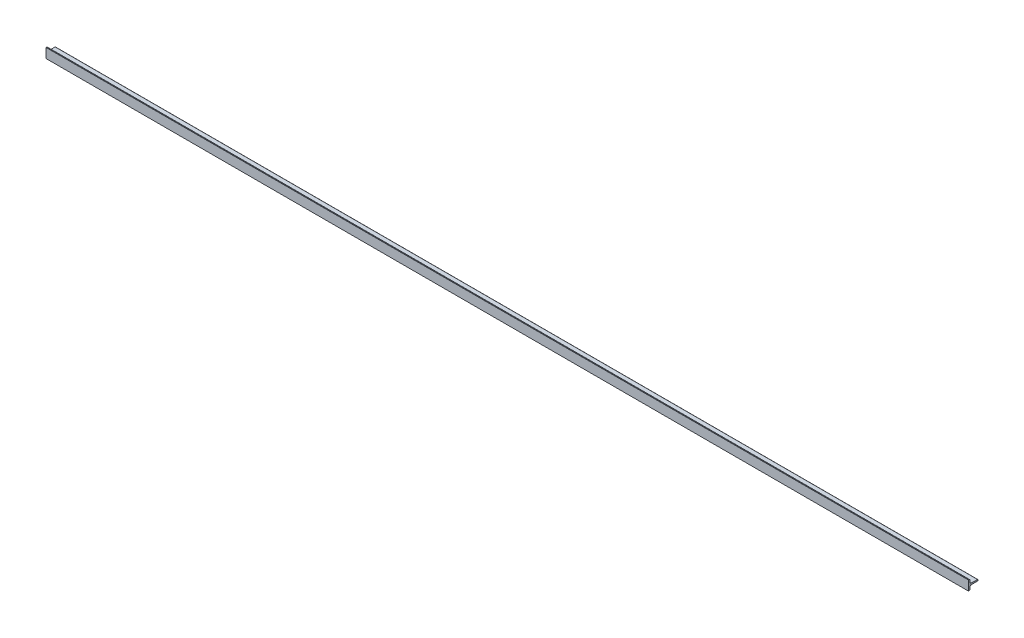
ISO-10303-21;
HEADER;
FILE_DESCRIPTION(('STEP AP214'),'2;1');
FILE_NAME('part.step','',(''),(''),'','','');
FILE_SCHEMA(('AUTOMOTIVE_DESIGN { 1 0 10303 214 1 1 1 1 }'));
ENDSEC;
DATA;
#1=APPLICATION_CONTEXT('core data for automotive mechanical design processes');
#2=APPLICATION_PROTOCOL_DEFINITION('international standard','automotive_design',2000,#1);
#3=PRODUCT_CONTEXT('',#1,'mechanical');
#4=PRODUCT('Part','Part','',(#3));
#5=PRODUCT_RELATED_PRODUCT_CATEGORY('part','',(#4));
#6=PRODUCT_DEFINITION_FORMATION('','',#4);
#7=PRODUCT_DEFINITION_CONTEXT('part definition',#1,'design');
#8=PRODUCT_DEFINITION('design','',#6,#7);
#9=PRODUCT_DEFINITION_SHAPE('','',#8);
#10=(LENGTH_UNIT() NAMED_UNIT(*) SI_UNIT(.MILLI.,.METRE.));
#11=(NAMED_UNIT(*) PLANE_ANGLE_UNIT() SI_UNIT($,.RADIAN.));
#12=(NAMED_UNIT(*) SI_UNIT($,.STERADIAN.) SOLID_ANGLE_UNIT());
#13=UNCERTAINTY_MEASURE_WITH_UNIT(LENGTH_MEASURE(1.E-05),#10,'distance_accuracy_value','');
#14=(GEOMETRIC_REPRESENTATION_CONTEXT(3) GLOBAL_UNCERTAINTY_ASSIGNED_CONTEXT((#13)) GLOBAL_UNIT_ASSIGNED_CONTEXT((#10,
#11,#12)) REPRESENTATION_CONTEXT('',''));
#15=CARTESIAN_POINT('',(0.,0.,0.));
#16=DIRECTION('',(0.,0.,1.));
#17=DIRECTION('',(1.,0.,0.));
#18=AXIS2_PLACEMENT_3D('',#15,#16,#17);
#19=CARTESIAN_POINT('',(1920.,-9.99999999999999,20.));
#20=DIRECTION('',(0.,1.,0.));
#21=DIRECTION('',(0.,0.,1.));
#22=AXIS2_PLACEMENT_3D('',#19,#20,#21);
#23=PLANE('',#22);
#24=DIRECTION('',(0.,0.,-1.));
#25=VECTOR('',#24,1.);
#26=CARTESIAN_POINT('',(0.,-9.99999999999999,20.));
#27=LINE('',#26,#25);
#28=CARTESIAN_POINT('',(0.,-9.99999999999999,20.));
#29=VERTEX_POINT('',#28);
#30=CARTESIAN_POINT('',(0.,-9.99999999999999,18.570314587422));
#31=VERTEX_POINT('',#30);
#32=EDGE_CURVE('E223',#29,#31,#27,.T.);
#33=ORIENTED_EDGE('',*,*,#32,.T.);
#34=DIRECTION('',(-1.,0.,0.));
#35=VECTOR('',#34,1.);
#36=CARTESIAN_POINT('',(1920.,-9.99999999999999,18.570314587422));
#37=LINE('',#36,#35);
#38=CARTESIAN_POINT('',(1920.,-9.99999999999999,18.570314587422));
#39=VERTEX_POINT('',#38);
#40=EDGE_CURVE('E13',#39,#31,#37,.T.);
#41=ORIENTED_EDGE('',*,*,#40,.F.);
#42=DIRECTION('',(0.,0.,-1.));
#43=VECTOR('',#42,1.);
#44=CARTESIAN_POINT('',(1920.,-9.99999999999999,20.));
#45=LINE('',#44,#43);
#46=CARTESIAN_POINT('',(1920.,-9.99999999999999,20.));
#47=VERTEX_POINT('',#46);
#48=EDGE_CURVE('E263',#47,#39,#45,.T.);
#49=ORIENTED_EDGE('',*,*,#48,.F.);
#50=DIRECTION('',(-1.,0.,0.));
#51=VECTOR('',#50,1.);
#52=CARTESIAN_POINT('',(1920.,-9.99999999999999,20.));
#53=LINE('',#52,#51);
#54=EDGE_CURVE('E219',#47,#29,#53,.T.);
#55=ORIENTED_EDGE('',*,*,#54,.T.);
#56=EDGE_LOOP('',(#33,#41,#49,#55));
#57=FACE_BOUND('',#56,.T.);
#58=ADVANCED_FACE('F86',(#57),#23,.F.);
#59=CARTESIAN_POINT('',(1920.,-8.49999999999999,18.570314587422));
#60=DIRECTION('',(-1.,0.,0.));
#61=DIRECTION('',(0.,0.,1.));
#62=AXIS2_PLACEMENT_3D('',#59,#60,#61);
#63=CYLINDRICAL_SURFACE('',#62,1.5);
#64=CARTESIAN_POINT('',(0.,-8.49999999999999,18.570314587422));
#65=DIRECTION('',(1.,0.,0.));
#66=DIRECTION('',(0.,0.,1.));
#67=AXIS2_PLACEMENT_3D('',#64,#65,#66);
#68=CIRCLE('',#67,1.5);
#69=CARTESIAN_POINT('',(0.,-8.53000020943977,17.0706146216177));
#70=VERTEX_POINT('',#69);
#71=EDGE_CURVE('E227',#31,#70,#68,.T.);
#72=ORIENTED_EDGE('',*,*,#71,.T.);
#73=DIRECTION('',(-1.,0.,0.));
#74=VECTOR('',#73,1.);
#75=CARTESIAN_POINT('',(1920.,-8.53000020943977,17.0706146216177));
#76=LINE('',#75,#74);
#77=CARTESIAN_POINT('',(1920.,-8.53000020943977,17.0706146216177));
#78=VERTEX_POINT('',#77);
#79=EDGE_CURVE('E95',#78,#70,#76,.T.);
#80=ORIENTED_EDGE('',*,*,#79,.F.);
#81=CARTESIAN_POINT('',(1920.,-8.49999999999999,18.570314587422));
#82=DIRECTION('',(1.,0.,0.));
#83=DIRECTION('',(0.,0.,1.));
#84=AXIS2_PLACEMENT_3D('',#81,#82,#83);
#85=CIRCLE('',#84,1.5);
#86=EDGE_CURVE('E164',#39,#78,#85,.T.);
#87=ORIENTED_EDGE('',*,*,#86,.F.);
#88=ORIENTED_EDGE('',*,*,#40,.T.);
#89=EDGE_LOOP('',(#72,#80,#87,#88));
#90=FACE_BOUND('',#89,.T.);
#91=ADVANCED_FACE('F371',(#90),#63,.T.);
#92=CARTESIAN_POINT('',(1920.,-4.52043643216432,16.9904067428265));
#93=DIRECTION('',(0.,0.020000139626522,0.9997999772029));
#94=DIRECTION('',(0.,-0.9997999772029,0.020000139626522));
#95=AXIS2_PLACEMENT_3D('',#92,#93,#94);
#96=PLANE('',#95);
#97=DIRECTION('',(0.,0.9997999772029,-0.020000139626522));
#98=VECTOR('',#97,1.);
#99=CARTESIAN_POINT('',(0.,-4.52043643216432,16.9904067428265));
#100=LINE('',#99,#98);
#101=CARTESIAN_POINT('',(0.,-4.52043643216432,16.9904067428265));
#102=VERTEX_POINT('',#101);
#103=EDGE_CURVE('E230',#70,#102,#100,.T.);
#104=ORIENTED_EDGE('',*,*,#103,.T.);
#105=DIRECTION('',(-1.,0.,0.));
#106=VECTOR('',#105,1.);
#107=CARTESIAN_POINT('',(1920.,-4.52043643216432,16.9904067428265));
#108=LINE('',#107,#106);
#109=CARTESIAN_POINT('',(1920.,-4.52043643216432,16.9904067428265));
#110=VERTEX_POINT('',#109);
#111=EDGE_CURVE('E298',#110,#102,#108,.T.);
#112=ORIENTED_EDGE('',*,*,#111,.F.);
#113=DIRECTION('',(0.,0.9997999772029,-0.020000139626522));
#114=VECTOR('',#113,1.);
#115=CARTESIAN_POINT('',(1920.,-4.52043643216432,16.9904067428265));
#116=LINE('',#115,#114);
#117=EDGE_CURVE('E308',#78,#110,#116,.T.);
#118=ORIENTED_EDGE('',*,*,#117,.F.);
#119=ORIENTED_EDGE('',*,*,#79,.T.);
#120=EDGE_LOOP('',(#104,#112,#118,#119));
#121=FACE_BOUND('',#120,.T.);
#122=ADVANCED_FACE('F306',(#121),#96,.F.);
#123=CARTESIAN_POINT('',(1920.,-4.58043685104389,13.9910068112178));
#124=DIRECTION('',(-1.,0.,0.));
#125=DIRECTION('',(0.,0.,1.));
#126=AXIS2_PLACEMENT_3D('',#123,#124,#125);
#127=CYLINDRICAL_SURFACE('',#126,3.);
#128=CARTESIAN_POINT('',(0.,-4.58043685104389,13.9910068112178));
#129=DIRECTION('',(-1.,0.,0.));
#130=DIRECTION('',(0.,0.,-1.));
#131=AXIS2_PLACEMENT_3D('',#128,#129,#130);
#132=CIRCLE('',#131,3.);
#133=CARTESIAN_POINT('',(0.,-1.58103691943519,14.0510072300973));
#134=VERTEX_POINT('',#133);
#135=EDGE_CURVE('E233',#102,#134,#132,.T.);
#136=ORIENTED_EDGE('',*,*,#135,.T.);
#137=DIRECTION('',(-1.,0.,0.));
#138=VECTOR('',#137,1.);
#139=CARTESIAN_POINT('',(1920.,-1.58103691943519,14.0510072300973));
#140=LINE('',#139,#138);
#141=CARTESIAN_POINT('',(1920.,-1.58103691943519,14.0510072300973));
#142=VERTEX_POINT('',#141);
#143=EDGE_CURVE('E294',#142,#134,#140,.T.);
#144=ORIENTED_EDGE('',*,*,#143,.F.);
#145=CARTESIAN_POINT('',(1920.,-4.58043685104389,13.9910068112178));
#146=DIRECTION('',(-1.,0.,0.));
#147=DIRECTION('',(0.,0.,-1.));
#148=AXIS2_PLACEMENT_3D('',#145,#146,#147);
#149=CIRCLE('',#148,3.);
#150=EDGE_CURVE('E327',#110,#142,#149,.T.);
#151=ORIENTED_EDGE('',*,*,#150,.F.);
#152=ORIENTED_EDGE('',*,*,#111,.T.);
#153=EDGE_LOOP('',(#136,#144,#151,#152));
#154=FACE_BOUND('',#153,.T.);
#155=ADVANCED_FACE('F317',(#154),#127,.F.);
#156=CARTESIAN_POINT('',(1920.,-1.3195626461658,0.97999986037347));
#157=DIRECTION('',(0.,0.9997999772029,0.0200001396265305));
#158=DIRECTION('',(0.,-0.0200001396265305,0.9997999772029));
#159=AXIS2_PLACEMENT_3D('',#156,#157,#158);
#160=PLANE('',#159);
#161=DIRECTION('',(0.,0.0200001396265305,-0.9997999772029));
#162=VECTOR('',#161,1.);
#163=CARTESIAN_POINT('',(0.,-1.3195626461658,0.97999986037347));
#164=LINE('',#163,#162);
#165=CARTESIAN_POINT('',(0.,-1.3195626461658,0.979999860373471));
#166=VERTEX_POINT('',#165);
#167=EDGE_CURVE('E236',#134,#166,#164,.T.);
#168=ORIENTED_EDGE('',*,*,#167,.T.);
#169=DIRECTION('',(-1.,0.,0.));
#170=VECTOR('',#169,1.);
#171=CARTESIAN_POINT('',(1920.,-1.3195626461658,0.979999860373471));
#172=LINE('',#171,#170);
#173=CARTESIAN_POINT('',(1920.,-1.3195626461658,0.979999860373471));
#174=VERTEX_POINT('',#173);
#175=EDGE_CURVE('E290',#174,#166,#172,.T.);
#176=ORIENTED_EDGE('',*,*,#175,.F.);
#177=DIRECTION('',(0.,0.0200001396265305,-0.9997999772029));
#178=VECTOR('',#177,1.);
#179=CARTESIAN_POINT('',(1920.,-1.3195626461658,0.97999986037347));
#180=LINE('',#179,#178);
#181=EDGE_CURVE('E323',#142,#174,#180,.T.);
#182=ORIENTED_EDGE('',*,*,#181,.F.);
#183=ORIENTED_EDGE('',*,*,#143,.T.);
#184=EDGE_LOOP('',(#168,#176,#182,#183));
#185=FACE_BOUND('',#184,.T.);
#186=ADVANCED_FACE('F321',(#185),#160,.F.);
#187=CARTESIAN_POINT('',(1920.,-0.319762668962899,1.));
#188=DIRECTION('',(-1.,0.,0.));
#189=DIRECTION('',(0.,0.,1.));
#190=AXIS2_PLACEMENT_3D('',#187,#188,#189);
#191=CYLINDRICAL_SURFACE('',#190,1.);
#192=CARTESIAN_POINT('',(0.,-0.319762668962899,1.));
#193=DIRECTION('',(1.,0.,0.));
#194=DIRECTION('',(0.,0.,1.));
#195=AXIS2_PLACEMENT_3D('',#192,#193,#194);
#196=CIRCLE('',#195,1.);
#197=CARTESIAN_POINT('',(0.,-0.319762668962899,0.));
#198=VERTEX_POINT('',#197);
#199=EDGE_CURVE('E239',#166,#198,#196,.T.);
#200=ORIENTED_EDGE('',*,*,#199,.T.);
#201=DIRECTION('',(-1.,0.,0.));
#202=VECTOR('',#201,1.);
#203=CARTESIAN_POINT('',(1920.,-0.319762668962899,0.));
#204=LINE('',#203,#202);
#205=CARTESIAN_POINT('',(1920.,-0.319762668962899,0.));
#206=VERTEX_POINT('',#205);
#207=EDGE_CURVE('E286',#206,#198,#204,.T.);
#208=ORIENTED_EDGE('',*,*,#207,.F.);
#209=CARTESIAN_POINT('',(1920.,-0.319762668962899,1.));
#210=DIRECTION('',(1.,0.,0.));
#211=DIRECTION('',(0.,0.,1.));
#212=AXIS2_PLACEMENT_3D('',#209,#210,#211);
#213=CIRCLE('',#212,1.);
#214=EDGE_CURVE('E326',#174,#206,#213,.T.);
#215=ORIENTED_EDGE('',*,*,#214,.F.);
#216=ORIENTED_EDGE('',*,*,#175,.T.);
#217=EDGE_LOOP('',(#200,#208,#215,#216));
#218=FACE_BOUND('',#217,.T.);
#219=ADVANCED_FACE('F384',(#218),#191,.T.);
#220=CARTESIAN_POINT('',(1920.,-0.319762668962899,0.));
#221=DIRECTION('',(0.,0.,1.));
#222=DIRECTION('',(0.,-1.,0.));
#223=AXIS2_PLACEMENT_3D('',#220,#221,#222);
#224=PLANE('',#223);
#225=DIRECTION('',(0.,1.,0.));
#226=VECTOR('',#225,1.);
#227=CARTESIAN_POINT('',(0.,-0.319762668962899,0.));
#228=LINE('',#227,#226);
#229=CARTESIAN_POINT('',(0.,0.319762668962919,0.));
#230=VERTEX_POINT('',#229);
#231=EDGE_CURVE('E242',#198,#230,#228,.T.);
#232=ORIENTED_EDGE('',*,*,#231,.T.);
#233=DIRECTION('',(-1.,0.,0.));
#234=VECTOR('',#233,1.);
#235=CARTESIAN_POINT('',(1920.,0.319762668962919,0.));
#236=LINE('',#235,#234);
#237=CARTESIAN_POINT('',(1920.,0.319762668962919,0.));
#238=VERTEX_POINT('',#237);
#239=EDGE_CURVE('E282',#238,#230,#236,.T.);
#240=ORIENTED_EDGE('',*,*,#239,.F.);
#241=DIRECTION('',(0.,1.,0.));
#242=VECTOR('',#241,1.);
#243=CARTESIAN_POINT('',(1920.,-0.319762668962899,0.));
#244=LINE('',#243,#242);
#245=EDGE_CURVE('E331',#206,#238,#244,.T.);
#246=ORIENTED_EDGE('',*,*,#245,.F.);
#247=ORIENTED_EDGE('',*,*,#207,.T.);
#248=EDGE_LOOP('',(#232,#240,#246,#247));
#249=FACE_BOUND('',#248,.T.);
#250=ADVANCED_FACE('F387',(#249),#224,.F.);
#251=CARTESIAN_POINT('',(1920.,0.319762668962918,1.));
#252=DIRECTION('',(-1.,0.,0.));
#253=DIRECTION('',(0.,0.,1.));
#254=AXIS2_PLACEMENT_3D('',#251,#252,#253);
#255=CYLINDRICAL_SURFACE('',#254,1.);
#256=CARTESIAN_POINT('',(0.,0.319762668962918,1.));
#257=DIRECTION('',(1.,0.,0.));
#258=DIRECTION('',(0.,0.,1.));
#259=AXIS2_PLACEMENT_3D('',#256,#257,#258);
#260=CIRCLE('',#259,1.);
#261=CARTESIAN_POINT('',(0.,1.31956264616582,0.97999986037347));
#262=VERTEX_POINT('',#261);
#263=EDGE_CURVE('E245',#230,#262,#260,.T.);
#264=ORIENTED_EDGE('',*,*,#263,.T.);
#265=DIRECTION('',(-1.,0.,0.));
#266=VECTOR('',#265,1.);
#267=CARTESIAN_POINT('',(1920.,1.31956264616582,0.97999986037347));
#268=LINE('',#267,#266);
#269=CARTESIAN_POINT('',(1920.,1.31956264616582,0.97999986037347));
#270=VERTEX_POINT('',#269);
#271=EDGE_CURVE('E278',#270,#262,#268,.T.);
#272=ORIENTED_EDGE('',*,*,#271,.F.);
#273=CARTESIAN_POINT('',(1920.,0.319762668962918,1.));
#274=DIRECTION('',(1.,0.,0.));
#275=DIRECTION('',(0.,0.,1.));
#276=AXIS2_PLACEMENT_3D('',#273,#274,#275);
#277=CIRCLE('',#276,1.);
#278=EDGE_CURVE('E338',#238,#270,#277,.T.);
#279=ORIENTED_EDGE('',*,*,#278,.F.);
#280=ORIENTED_EDGE('',*,*,#239,.T.);
#281=EDGE_LOOP('',(#264,#272,#279,#280));
#282=FACE_BOUND('',#281,.T.);
#283=ADVANCED_FACE('F391',(#282),#255,.T.);
#284=CARTESIAN_POINT('',(1920.,1.58103691943522,14.0510072300973));
#285=DIRECTION('',(0.,-0.9997999772029,0.0200001396265308));
#286=DIRECTION('',(0.,-0.0200001396265308,-0.9997999772029));
#287=AXIS2_PLACEMENT_3D('',#284,#285,#286);
#288=PLANE('',#287);
#289=DIRECTION('',(0.,0.0200001396265308,0.9997999772029));
#290=VECTOR('',#289,1.);
#291=CARTESIAN_POINT('',(0.,1.58103691943522,14.0510072300973));
#292=LINE('',#291,#290);
#293=CARTESIAN_POINT('',(0.,1.58103691943521,14.0510072300973));
#294=VERTEX_POINT('',#293);
#295=EDGE_CURVE('E248',#262,#294,#292,.T.);
#296=ORIENTED_EDGE('',*,*,#295,.T.);
#297=DIRECTION('',(-1.,0.,0.));
#298=VECTOR('',#297,1.);
#299=CARTESIAN_POINT('',(1920.,1.58103691943521,14.0510072300973));
#300=LINE('',#299,#298);
#301=CARTESIAN_POINT('',(1920.,1.58103691943521,14.0510072300973));
#302=VERTEX_POINT('',#301);
#303=EDGE_CURVE('E274',#302,#294,#300,.T.);
#304=ORIENTED_EDGE('',*,*,#303,.F.);
#305=DIRECTION('',(0.,0.0200001396265308,0.9997999772029));
#306=VECTOR('',#305,1.);
#307=CARTESIAN_POINT('',(1920.,1.58103691943522,14.0510072300973));
#308=LINE('',#307,#306);
#309=EDGE_CURVE('E341',#270,#302,#308,.T.);
#310=ORIENTED_EDGE('',*,*,#309,.F.);
#311=ORIENTED_EDGE('',*,*,#271,.T.);
#312=EDGE_LOOP('',(#296,#304,#310,#311));
#313=FACE_BOUND('',#312,.T.);
#314=ADVANCED_FACE('F395',(#313),#288,.F.);
#315=CARTESIAN_POINT('',(1920.,4.58043685104392,13.9910068112178));
#316=DIRECTION('',(-1.,0.,0.));
#317=DIRECTION('',(0.,0.,1.));
#318=AXIS2_PLACEMENT_3D('',#315,#316,#317);
#319=CYLINDRICAL_SURFACE('',#318,3.);
#320=CARTESIAN_POINT('',(0.,4.58043685104392,13.9910068112178));
#321=DIRECTION('',(-1.,0.,0.));
#322=DIRECTION('',(0.,0.,-1.));
#323=AXIS2_PLACEMENT_3D('',#320,#321,#322);
#324=CIRCLE('',#323,3.);
#325=CARTESIAN_POINT('',(0.,4.52043643216434,16.9904067428265));
#326=VERTEX_POINT('',#325);
#327=EDGE_CURVE('E251',#294,#326,#324,.T.);
#328=ORIENTED_EDGE('',*,*,#327,.T.);
#329=DIRECTION('',(-1.,0.,0.));
#330=VECTOR('',#329,1.);
#331=CARTESIAN_POINT('',(1920.,4.52043643216434,16.9904067428265));
#332=LINE('',#331,#330);
#333=CARTESIAN_POINT('',(1920.,4.52043643216434,16.9904067428265));
#334=VERTEX_POINT('',#333);
#335=EDGE_CURVE('E270',#334,#326,#332,.T.);
#336=ORIENTED_EDGE('',*,*,#335,.F.);
#337=CARTESIAN_POINT('',(1920.,4.58043685104392,13.9910068112178));
#338=DIRECTION('',(-1.,0.,0.));
#339=DIRECTION('',(0.,0.,-1.));
#340=AXIS2_PLACEMENT_3D('',#337,#338,#339);
#341=CIRCLE('',#340,3.);
#342=EDGE_CURVE('E344',#302,#334,#341,.T.);
#343=ORIENTED_EDGE('',*,*,#342,.F.);
#344=ORIENTED_EDGE('',*,*,#303,.T.);
#345=EDGE_LOOP('',(#328,#336,#343,#344));
#346=FACE_BOUND('',#345,.T.);
#347=ADVANCED_FACE('F352',(#346),#319,.F.);
#348=CARTESIAN_POINT('',(1920.,8.53000020943979,17.0706146216177));
#349=DIRECTION('',(0.,-0.020000139626522,0.9997999772029));
#350=DIRECTION('',(0.,-0.9997999772029,-0.020000139626522));
#351=AXIS2_PLACEMENT_3D('',#348,#349,#350);
#352=PLANE('',#351);
#353=DIRECTION('',(0.,0.9997999772029,0.020000139626522));
#354=VECTOR('',#353,1.);
#355=CARTESIAN_POINT('',(0.,8.53000020943979,17.0706146216177));
#356=LINE('',#355,#354);
#357=CARTESIAN_POINT('',(0.,8.53000020943979,17.0706146216177));
#358=VERTEX_POINT('',#357);
#359=EDGE_CURVE('E254',#326,#358,#356,.T.);
#360=ORIENTED_EDGE('',*,*,#359,.T.);
#361=DIRECTION('',(-1.,0.,0.));
#362=VECTOR('',#361,1.);
#363=CARTESIAN_POINT('',(1920.,8.53000020943979,17.0706146216177));
#364=LINE('',#363,#362);
#365=CARTESIAN_POINT('',(1920.,8.53000020943979,17.0706146216177));
#366=VERTEX_POINT('',#365);
#367=EDGE_CURVE('E212',#366,#358,#364,.T.);
#368=ORIENTED_EDGE('',*,*,#367,.F.);
#369=DIRECTION('',(0.,0.9997999772029,0.020000139626522));
#370=VECTOR('',#369,1.);
#371=CARTESIAN_POINT('',(1920.,8.53000020943979,17.0706146216177));
#372=LINE('',#371,#370);
#373=EDGE_CURVE('E201',#334,#366,#372,.T.);
#374=ORIENTED_EDGE('',*,*,#373,.F.);
#375=ORIENTED_EDGE('',*,*,#335,.T.);
#376=EDGE_LOOP('',(#360,#368,#374,#375));
#377=FACE_BOUND('',#376,.T.);
#378=ADVANCED_FACE('F356',(#377),#352,.F.);
#379=CARTESIAN_POINT('',(1920.,8.50000000000001,18.570314587422));
#380=DIRECTION('',(-1.,0.,0.));
#381=DIRECTION('',(0.,0.,1.));
#382=AXIS2_PLACEMENT_3D('',#379,#380,#381);
#383=CYLINDRICAL_SURFACE('',#382,1.5);
#384=CARTESIAN_POINT('',(0.,8.50000000000001,18.570314587422));
#385=DIRECTION('',(1.,0.,0.));
#386=DIRECTION('',(0.,0.,-1.));
#387=AXIS2_PLACEMENT_3D('',#384,#385,#386);
#388=CIRCLE('',#387,1.5);
#389=CARTESIAN_POINT('',(0.,10.,18.570314587422));
#390=VERTEX_POINT('',#389);
#391=EDGE_CURVE('E210',#358,#390,#388,.T.);
#392=ORIENTED_EDGE('',*,*,#391,.T.);
#393=DIRECTION('',(-1.,0.,0.));
#394=VECTOR('',#393,1.);
#395=CARTESIAN_POINT('',(1920.,10.,18.570314587422));
#396=LINE('',#395,#394);
#397=CARTESIAN_POINT('',(1920.,10.,18.570314587422));
#398=VERTEX_POINT('',#397);
#399=EDGE_CURVE('E207',#398,#390,#396,.T.);
#400=ORIENTED_EDGE('',*,*,#399,.F.);
#401=CARTESIAN_POINT('',(1920.,8.50000000000001,18.570314587422));
#402=DIRECTION('',(1.,0.,0.));
#403=DIRECTION('',(0.,0.,-1.));
#404=AXIS2_PLACEMENT_3D('',#401,#402,#403);
#405=CIRCLE('',#404,1.5);
#406=EDGE_CURVE('E195',#366,#398,#405,.T.);
#407=ORIENTED_EDGE('',*,*,#406,.F.);
#408=ORIENTED_EDGE('',*,*,#367,.T.);
#409=EDGE_LOOP('',(#392,#400,#407,#408));
#410=FACE_BOUND('',#409,.T.);
#411=ADVANCED_FACE('F208',(#410),#383,.T.);
#412=CARTESIAN_POINT('',(1920.,10.,20.));
#413=DIRECTION('',(0.,-1.,0.));
#414=DIRECTION('',(0.,0.,-1.));
#415=AXIS2_PLACEMENT_3D('',#412,#413,#414);
#416=PLANE('',#415);
#417=DIRECTION('',(0.,0.,1.));
#418=VECTOR('',#417,1.);
#419=CARTESIAN_POINT('',(0.,10.,20.));
#420=LINE('',#419,#418);
#421=CARTESIAN_POINT('',(0.,10.,20.));
#422=VERTEX_POINT('',#421);
#423=EDGE_CURVE('E150',#390,#422,#420,.T.);
#424=ORIENTED_EDGE('',*,*,#423,.T.);
#425=DIRECTION('',(-1.,0.,0.));
#426=VECTOR('',#425,1.);
#427=CARTESIAN_POINT('',(1920.,10.,20.));
#428=LINE('',#427,#426);
#429=CARTESIAN_POINT('',(1920.,10.,20.));
#430=VERTEX_POINT('',#429);
#431=EDGE_CURVE('E213',#430,#422,#428,.T.);
#432=ORIENTED_EDGE('',*,*,#431,.F.);
#433=DIRECTION('',(0.,0.,1.));
#434=VECTOR('',#433,1.);
#435=CARTESIAN_POINT('',(1920.,10.,20.));
#436=LINE('',#435,#434);
#437=EDGE_CURVE('E199',#398,#430,#436,.T.);
#438=ORIENTED_EDGE('',*,*,#437,.F.);
#439=ORIENTED_EDGE('',*,*,#399,.T.);
#440=EDGE_LOOP('',(#424,#432,#438,#439));
#441=FACE_BOUND('',#440,.T.);
#442=ADVANCED_FACE('F215',(#441),#416,.F.);
#443=CARTESIAN_POINT('',(1920.,-9.99999999999999,20.));
#444=DIRECTION('',(0.,0.,-1.));
#445=DIRECTION('',(-1.,0.,0.));
#446=AXIS2_PLACEMENT_3D('',#443,#444,#445);
#447=PLANE('',#446);
#448=DIRECTION('',(0.,-1.,0.));
#449=VECTOR('',#448,1.);
#450=CARTESIAN_POINT('',(0.,-9.99999999999999,20.));
#451=LINE('',#450,#449);
#452=EDGE_CURVE('E156',#422,#29,#451,.T.);
#453=ORIENTED_EDGE('',*,*,#452,.T.);
#454=ORIENTED_EDGE('',*,*,#54,.F.);
#455=DIRECTION('',(0.,-1.,0.));
#456=VECTOR('',#455,1.);
#457=CARTESIAN_POINT('',(1920.,-9.99999999999999,20.));
#458=LINE('',#457,#456);
#459=EDGE_CURVE('E103',#430,#47,#458,.T.);
#460=ORIENTED_EDGE('',*,*,#459,.F.);
#461=ORIENTED_EDGE('',*,*,#431,.T.);
#462=EDGE_LOOP('',(#453,#454,#460,#461));
#463=FACE_BOUND('',#462,.T.);
#464=ADVANCED_FACE('F360',(#463),#447,.F.);
#465=CARTESIAN_POINT('',(1920.,-8.49999999999999,18.570314587422));
#466=DIRECTION('',(-1.,0.,0.));
#467=DIRECTION('',(0.,0.,1.));
#468=AXIS2_PLACEMENT_3D('',#465,#466,#467);
#469=PLANE('',#468);
#470=ORIENTED_EDGE('',*,*,#48,.T.);
#471=ORIENTED_EDGE('',*,*,#86,.T.);
#472=ORIENTED_EDGE('',*,*,#117,.T.);
#473=ORIENTED_EDGE('',*,*,#150,.T.);
#474=ORIENTED_EDGE('',*,*,#181,.T.);
#475=ORIENTED_EDGE('',*,*,#214,.T.);
#476=ORIENTED_EDGE('',*,*,#245,.T.);
#477=ORIENTED_EDGE('',*,*,#278,.T.);
#478=ORIENTED_EDGE('',*,*,#309,.T.);
#479=ORIENTED_EDGE('',*,*,#342,.T.);
#480=ORIENTED_EDGE('',*,*,#373,.T.);
#481=ORIENTED_EDGE('',*,*,#406,.T.);
#482=ORIENTED_EDGE('',*,*,#437,.T.);
#483=ORIENTED_EDGE('',*,*,#459,.T.);
#484=EDGE_LOOP('',(#470,#471,#472,#473,#474,#475,#476,#477,#478,#479,#480,#481,#482,#483));
#485=FACE_BOUND('',#484,.T.);
#486=ADVANCED_FACE('F197',(#485),#469,.F.);
#487=CARTESIAN_POINT('',(0.,-8.49999999999999,18.570314587422));
#488=DIRECTION('',(-1.,0.,0.));
#489=DIRECTION('',(0.,0.,1.));
#490=AXIS2_PLACEMENT_3D('',#487,#488,#489);
#491=PLANE('',#490);
#492=ORIENTED_EDGE('',*,*,#32,.F.);
#493=ORIENTED_EDGE('',*,*,#452,.F.);
#494=ORIENTED_EDGE('',*,*,#423,.F.);
#495=ORIENTED_EDGE('',*,*,#391,.F.);
#496=ORIENTED_EDGE('',*,*,#359,.F.);
#497=ORIENTED_EDGE('',*,*,#327,.F.);
#498=ORIENTED_EDGE('',*,*,#295,.F.);
#499=ORIENTED_EDGE('',*,*,#263,.F.);
#500=ORIENTED_EDGE('',*,*,#231,.F.);
#501=ORIENTED_EDGE('',*,*,#199,.F.);
#502=ORIENTED_EDGE('',*,*,#167,.F.);
#503=ORIENTED_EDGE('',*,*,#135,.F.);
#504=ORIENTED_EDGE('',*,*,#103,.F.);
#505=ORIENTED_EDGE('',*,*,#71,.F.);
#506=EDGE_LOOP('',(#492,#493,#494,#495,#496,#497,#498,#499,#500,#501,#502,#503,#504,#505));
#507=FACE_BOUND('',#506,.T.);
#508=ADVANCED_FACE('F312',(#507),#491,.T.);
#509=CLOSED_SHELL('',(#58,#91,#122,#155,#186,#219,#250,#283,#314,#347,#378,#411,#442,#464,#486,#508));
#510=MANIFOLD_SOLID_BREP('B2',#509);
#511=ADVANCED_BREP_SHAPE_REPRESENTATION('',(#18,#510),#14);
#512=SHAPE_DEFINITION_REPRESENTATION(#9,#511);
ENDSEC;
END-ISO-10303-21;
